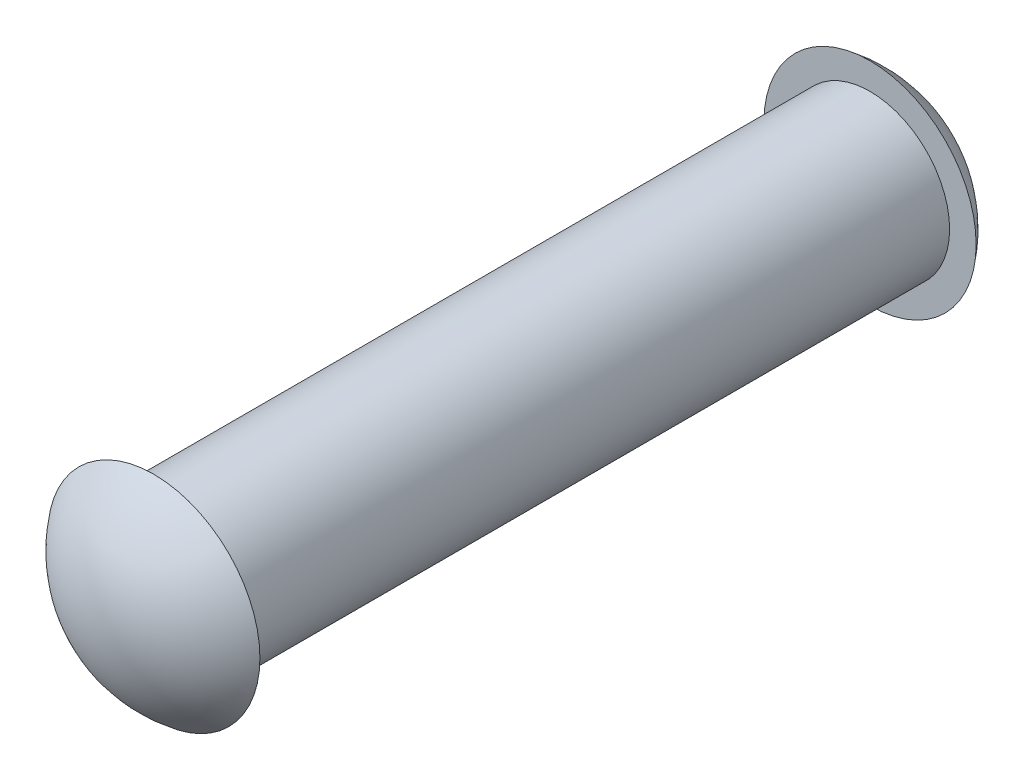
ISO-10303-21;
HEADER;
FILE_DESCRIPTION(('STEP AP214'),'2;1');
FILE_NAME('part.step','',(''),(''),'','','');
FILE_SCHEMA(('AUTOMOTIVE_DESIGN { 1 0 10303 214 1 1 1 1 }'));
ENDSEC;
DATA;
#1=APPLICATION_CONTEXT('core data for automotive mechanical design processes');
#2=APPLICATION_PROTOCOL_DEFINITION('international standard','automotive_design',2000,#1);
#3=PRODUCT_CONTEXT('',#1,'mechanical');
#4=PRODUCT('Part','Part','',(#3));
#5=PRODUCT_RELATED_PRODUCT_CATEGORY('part','',(#4));
#6=PRODUCT_DEFINITION_FORMATION('','',#4);
#7=PRODUCT_DEFINITION_CONTEXT('part definition',#1,'design');
#8=PRODUCT_DEFINITION('design','',#6,#7);
#9=PRODUCT_DEFINITION_SHAPE('','',#8);
#10=(LENGTH_UNIT() NAMED_UNIT(*) SI_UNIT(.MILLI.,.METRE.));
#11=(NAMED_UNIT(*) PLANE_ANGLE_UNIT() SI_UNIT($,.RADIAN.));
#12=(NAMED_UNIT(*) SI_UNIT($,.STERADIAN.) SOLID_ANGLE_UNIT());
#13=UNCERTAINTY_MEASURE_WITH_UNIT(LENGTH_MEASURE(1.E-05),#10,'distance_accuracy_value','');
#14=(GEOMETRIC_REPRESENTATION_CONTEXT(3) GLOBAL_UNCERTAINTY_ASSIGNED_CONTEXT((#13)) GLOBAL_UNIT_ASSIGNED_CONTEXT((#10,
#11,#12)) REPRESENTATION_CONTEXT('',''));
#15=CARTESIAN_POINT('',(0.,0.,0.));
#16=DIRECTION('',(0.,0.,1.));
#17=DIRECTION('',(1.,0.,0.));
#18=AXIS2_PLACEMENT_3D('',#15,#16,#17);
#19=CARTESIAN_POINT('',(-23.1698729810778,0.,-35.4852813742386));
#20=DIRECTION('',(0.,0.,1.));
#21=DIRECTION('',(1.,0.,0.));
#22=AXIS2_PLACEMENT_3D('',#19,#20,#21);
#23=CYLINDRICAL_SURFACE('',#22,3.);
#24=CARTESIAN_POINT('',(-23.1698729810778,0.,-27.));
#25=DIRECTION('',(0.,0.,1.));
#26=DIRECTION('',(1.,0.,0.));
#27=AXIS2_PLACEMENT_3D('',#24,#25,#26);
#28=CIRCLE('',#27,3.);
#29=CARTESIAN_POINT('',(-20.1698729810778,0.,-27.));
#30=VERTEX_POINT('',#29);
#31=EDGE_CURVE('E10',#30,#30,#28,.F.);
#32=ORIENTED_EDGE('',*,*,#31,.F.);
#33=EDGE_LOOP('',(#32));
#34=FACE_BOUND('',#33,.T.);
#35=CARTESIAN_POINT('',(-23.1698729810778,0.,0.));
#36=DIRECTION('',(0.,0.,1.));
#37=DIRECTION('',(1.,0.,0.));
#38=AXIS2_PLACEMENT_3D('',#35,#36,#37);
#39=CIRCLE('',#38,3.);
#40=CARTESIAN_POINT('',(-20.1698729810778,0.,0.));
#41=VERTEX_POINT('',#40);
#42=EDGE_CURVE('E40',#41,#41,#39,.T.);
#43=ORIENTED_EDGE('',*,*,#42,.F.);
#44=EDGE_LOOP('',(#43));
#45=FACE_BOUND('',#44,.T.);
#46=ADVANCED_FACE('F34',(#34,#45),#23,.T.);
#47=CARTESIAN_POINT('',(-19.1698729810778,0.,0.));
#48=DIRECTION('',(0.,0.,1.));
#49=DIRECTION('',(1.,0.,0.));
#50=AXIS2_PLACEMENT_3D('',#47,#48,#49);
#51=PLANE('',#50);
#52=ORIENTED_EDGE('',*,*,#42,.T.);
#53=EDGE_LOOP('',(#52));
#54=FACE_BOUND('',#53,.T.);
#55=CARTESIAN_POINT('',(-23.1698729810778,0.,0.));
#56=DIRECTION('',(0.,0.,-1.));
#57=DIRECTION('',(-1.,0.,0.));
#58=AXIS2_PLACEMENT_3D('',#55,#56,#57);
#59=CIRCLE('',#58,4.);
#60=CARTESIAN_POINT('',(-27.1698729810778,0.,0.));
#61=VERTEX_POINT('',#60);
#62=EDGE_CURVE('E44',#61,#61,#59,.T.);
#63=ORIENTED_EDGE('',*,*,#62,.T.);
#64=EDGE_LOOP('',(#63));
#65=FACE_BOUND('',#64,.T.);
#66=ADVANCED_FACE('F65',(#54,#65),#51,.F.);
#67=CARTESIAN_POINT('',(-23.1698729810778,0.,-3.00000000000001));
#68=DIRECTION('',(0.,0.,-1.));
#69=DIRECTION('',(1.,0.,0.));
#70=AXIS2_PLACEMENT_3D('',#67,#68,#69);
#71=SPHERICAL_SURFACE('',#70,5.);
#72=ORIENTED_EDGE('',*,*,#62,.F.);
#73=EDGE_LOOP('',(#72));
#74=FACE_BOUND('',#73,.T.);
#75=ADVANCED_FACE('F58',(#74),#71,.T.);
#76=CARTESIAN_POINT('',(-19.1698729810778,0.,-27.));
#77=DIRECTION('',(0.,0.,-1.));
#78=DIRECTION('',(1.,0.,0.));
#79=AXIS2_PLACEMENT_3D('',#76,#77,#78);
#80=PLANE('',#79);
#81=ORIENTED_EDGE('',*,*,#31,.T.);
#82=EDGE_LOOP('',(#81));
#83=FACE_BOUND('',#82,.T.);
#84=CARTESIAN_POINT('',(-23.1698729810778,0.,-27.));
#85=DIRECTION('',(0.,0.,-1.));
#86=DIRECTION('',(-1.,0.,0.));
#87=AXIS2_PLACEMENT_3D('',#84,#85,#86);
#88=CIRCLE('',#87,4.);
#89=CARTESIAN_POINT('',(-27.1698729810778,0.,-27.));
#90=VERTEX_POINT('',#89);
#91=EDGE_CURVE('E48',#90,#90,#88,.T.);
#92=ORIENTED_EDGE('',*,*,#91,.F.);
#93=EDGE_LOOP('',(#92));
#94=FACE_BOUND('',#93,.T.);
#95=ADVANCED_FACE('F56',(#83,#94),#80,.F.);
#96=CARTESIAN_POINT('',(-23.1698729810778,0.,-24.));
#97=DIRECTION('',(0.,0.,1.));
#98=DIRECTION('',(1.,0.,0.));
#99=AXIS2_PLACEMENT_3D('',#96,#97,#98);
#100=SPHERICAL_SURFACE('',#99,5.);
#101=ORIENTED_EDGE('',*,*,#91,.T.);
#102=EDGE_LOOP('',(#101));
#103=FACE_BOUND('',#102,.T.);
#104=ADVANCED_FACE('F54',(#103),#100,.T.);
#105=CLOSED_SHELL('',(#46,#66,#75,#95,#104));
#106=MANIFOLD_SOLID_BREP('B2',#105);
#107=ADVANCED_BREP_SHAPE_REPRESENTATION('',(#18,#106),#14);
#108=SHAPE_DEFINITION_REPRESENTATION(#9,#107);
ENDSEC;
END-ISO-10303-21;
